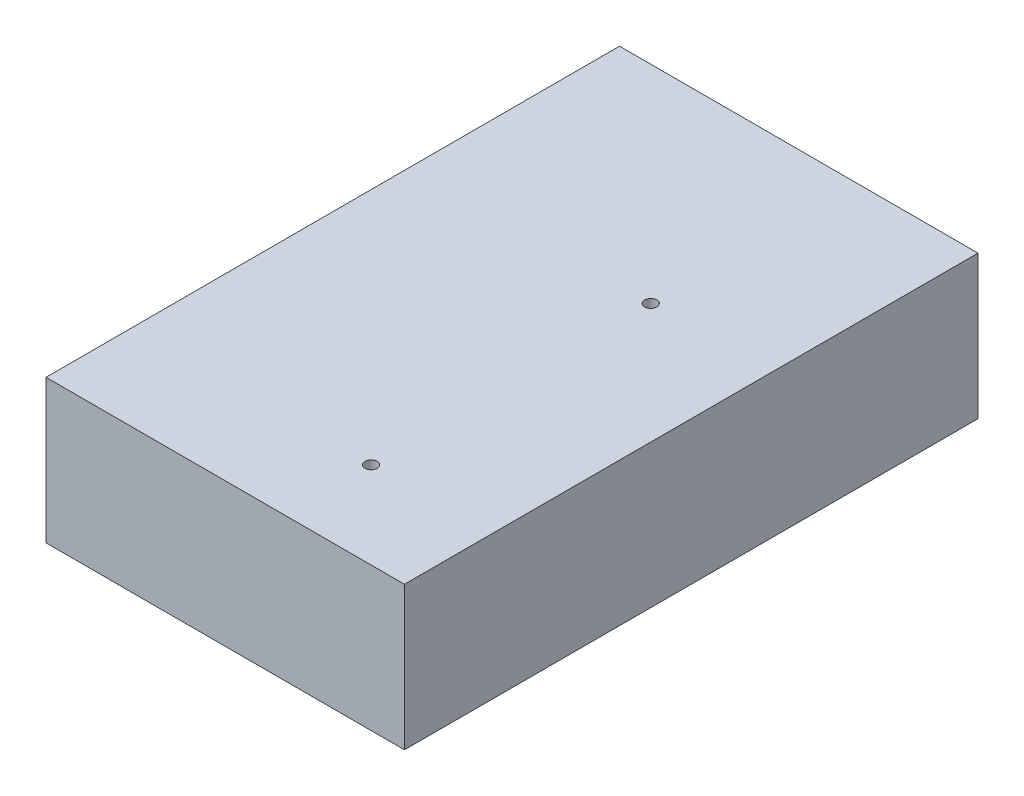
ISO-10303-21;
HEADER;
FILE_DESCRIPTION(('STEP AP214'),'2;1');
FILE_NAME('part.step','',(''),(''),'','','');
FILE_SCHEMA(('AUTOMOTIVE_DESIGN { 1 0 10303 214 1 1 1 1 }'));
ENDSEC;
DATA;
#1=APPLICATION_CONTEXT('core data for automotive mechanical design processes');
#2=APPLICATION_PROTOCOL_DEFINITION('international standard','automotive_design',2000,#1);
#3=PRODUCT_CONTEXT('',#1,'mechanical');
#4=PRODUCT('Part','Part','',(#3));
#5=PRODUCT_RELATED_PRODUCT_CATEGORY('part','',(#4));
#6=PRODUCT_DEFINITION_FORMATION('','',#4);
#7=PRODUCT_DEFINITION_CONTEXT('part definition',#1,'design');
#8=PRODUCT_DEFINITION('design','',#6,#7);
#9=PRODUCT_DEFINITION_SHAPE('','',#8);
#10=(LENGTH_UNIT() NAMED_UNIT(*) SI_UNIT(.MILLI.,.METRE.));
#11=(NAMED_UNIT(*) PLANE_ANGLE_UNIT() SI_UNIT($,.RADIAN.));
#12=(NAMED_UNIT(*) SI_UNIT($,.STERADIAN.) SOLID_ANGLE_UNIT());
#13=UNCERTAINTY_MEASURE_WITH_UNIT(LENGTH_MEASURE(1.E-05),#10,'distance_accuracy_value','');
#14=(GEOMETRIC_REPRESENTATION_CONTEXT(3) GLOBAL_UNCERTAINTY_ASSIGNED_CONTEXT((#13)) GLOBAL_UNIT_ASSIGNED_CONTEXT((#10,
#11,#12)) REPRESENTATION_CONTEXT('',''));
#15=CARTESIAN_POINT('',(0.,0.,0.));
#16=DIRECTION('',(0.,0.,1.));
#17=DIRECTION('',(1.,0.,0.));
#18=AXIS2_PLACEMENT_3D('',#15,#16,#17);
#19=CARTESIAN_POINT('',(50.,40.,80.));
#20=DIRECTION('',(-1.,0.,0.));
#21=DIRECTION('',(0.,0.,1.));
#22=AXIS2_PLACEMENT_3D('',#19,#20,#21);
#23=PLANE('',#22);
#24=DIRECTION('',(0.,0.,-1.));
#25=VECTOR('',#24,1.);
#26=CARTESIAN_POINT('',(50.,0.,80.));
#27=LINE('',#26,#25);
#28=CARTESIAN_POINT('',(50.,0.,80.));
#29=VERTEX_POINT('',#28);
#30=CARTESIAN_POINT('',(50.,0.,-80.));
#31=VERTEX_POINT('',#30);
#32=EDGE_CURVE('E98',#29,#31,#27,.T.);
#33=ORIENTED_EDGE('',*,*,#32,.T.);
#34=DIRECTION('',(0.,-1.,0.));
#35=VECTOR('',#34,1.);
#36=CARTESIAN_POINT('',(50.,40.,-80.));
#37=LINE('',#36,#35);
#38=CARTESIAN_POINT('',(50.,40.,-80.));
#39=VERTEX_POINT('',#38);
#40=EDGE_CURVE('E11',#39,#31,#37,.T.);
#41=ORIENTED_EDGE('',*,*,#40,.F.);
#42=DIRECTION('',(0.,0.,-1.));
#43=VECTOR('',#42,1.);
#44=CARTESIAN_POINT('',(50.,40.,80.));
#45=LINE('',#44,#43);
#46=CARTESIAN_POINT('',(50.,40.,80.));
#47=VERTEX_POINT('',#46);
#48=EDGE_CURVE('E86',#47,#39,#45,.T.);
#49=ORIENTED_EDGE('',*,*,#48,.F.);
#50=DIRECTION('',(0.,-1.,0.));
#51=VECTOR('',#50,1.);
#52=CARTESIAN_POINT('',(50.,40.,80.));
#53=LINE('',#52,#51);
#54=EDGE_CURVE('E94',#47,#29,#53,.T.);
#55=ORIENTED_EDGE('',*,*,#54,.T.);
#56=EDGE_LOOP('',(#33,#41,#49,#55));
#57=FACE_BOUND('',#56,.T.);
#58=ADVANCED_FACE('F35',(#57),#23,.F.);
#59=CARTESIAN_POINT('',(-50.,40.,-80.));
#60=DIRECTION('',(0.,0.,1.));
#61=DIRECTION('',(1.,0.,0.));
#62=AXIS2_PLACEMENT_3D('',#59,#60,#61);
#63=PLANE('',#62);
#64=DIRECTION('',(-1.,0.,0.));
#65=VECTOR('',#64,1.);
#66=CARTESIAN_POINT('',(-50.,0.,-80.));
#67=LINE('',#66,#65);
#68=CARTESIAN_POINT('',(-50.,0.,-80.));
#69=VERTEX_POINT('',#68);
#70=EDGE_CURVE('E90',#31,#69,#67,.T.);
#71=ORIENTED_EDGE('',*,*,#70,.T.);
#72=DIRECTION('',(0.,-1.,0.));
#73=VECTOR('',#72,1.);
#74=CARTESIAN_POINT('',(-50.,40.,-80.));
#75=LINE('',#74,#73);
#76=CARTESIAN_POINT('',(-50.,40.,-80.));
#77=VERTEX_POINT('',#76);
#78=EDGE_CURVE('E43',#77,#69,#75,.T.);
#79=ORIENTED_EDGE('',*,*,#78,.F.);
#80=DIRECTION('',(-1.,0.,0.));
#81=VECTOR('',#80,1.);
#82=CARTESIAN_POINT('',(-50.,40.,-80.));
#83=LINE('',#82,#81);
#84=EDGE_CURVE('E81',#39,#77,#83,.T.);
#85=ORIENTED_EDGE('',*,*,#84,.F.);
#86=ORIENTED_EDGE('',*,*,#40,.T.);
#87=EDGE_LOOP('',(#71,#79,#85,#86));
#88=FACE_BOUND('',#87,.T.);
#89=ADVANCED_FACE('F89',(#88),#63,.F.);
#90=CARTESIAN_POINT('',(-50.,40.,80.));
#91=DIRECTION('',(1.,0.,0.));
#92=DIRECTION('',(0.,0.,-1.));
#93=AXIS2_PLACEMENT_3D('',#90,#91,#92);
#94=PLANE('',#93);
#95=DIRECTION('',(0.,0.,1.));
#96=VECTOR('',#95,1.);
#97=CARTESIAN_POINT('',(-50.,0.,80.));
#98=LINE('',#97,#96);
#99=CARTESIAN_POINT('',(-50.,0.,80.));
#100=VERTEX_POINT('',#99);
#101=EDGE_CURVE('E68',#69,#100,#98,.T.);
#102=ORIENTED_EDGE('',*,*,#101,.T.);
#103=DIRECTION('',(0.,-1.,0.));
#104=VECTOR('',#103,1.);
#105=CARTESIAN_POINT('',(-50.,40.,80.));
#106=LINE('',#105,#104);
#107=CARTESIAN_POINT('',(-50.,40.,80.));
#108=VERTEX_POINT('',#107);
#109=EDGE_CURVE('E91',#108,#100,#106,.T.);
#110=ORIENTED_EDGE('',*,*,#109,.F.);
#111=DIRECTION('',(0.,0.,1.));
#112=VECTOR('',#111,1.);
#113=CARTESIAN_POINT('',(-50.,40.,80.));
#114=LINE('',#113,#112);
#115=EDGE_CURVE('E84',#77,#108,#114,.T.);
#116=ORIENTED_EDGE('',*,*,#115,.F.);
#117=ORIENTED_EDGE('',*,*,#78,.T.);
#118=EDGE_LOOP('',(#102,#110,#116,#117));
#119=FACE_BOUND('',#118,.T.);
#120=ADVANCED_FACE('F92',(#119),#94,.F.);
#121=CARTESIAN_POINT('',(-50.,40.,80.));
#122=DIRECTION('',(0.,0.,-1.));
#123=DIRECTION('',(-1.,0.,0.));
#124=AXIS2_PLACEMENT_3D('',#121,#122,#123);
#125=PLANE('',#124);
#126=DIRECTION('',(1.,0.,0.));
#127=VECTOR('',#126,1.);
#128=CARTESIAN_POINT('',(-50.,0.,80.));
#129=LINE('',#128,#127);
#130=EDGE_CURVE('E74',#100,#29,#129,.T.);
#131=ORIENTED_EDGE('',*,*,#130,.T.);
#132=ORIENTED_EDGE('',*,*,#54,.F.);
#133=DIRECTION('',(1.,0.,0.));
#134=VECTOR('',#133,1.);
#135=CARTESIAN_POINT('',(-50.,40.,80.));
#136=LINE('',#135,#134);
#137=EDGE_CURVE('E51',#108,#47,#136,.T.);
#138=ORIENTED_EDGE('',*,*,#137,.F.);
#139=ORIENTED_EDGE('',*,*,#109,.T.);
#140=EDGE_LOOP('',(#131,#132,#138,#139));
#141=FACE_BOUND('',#140,.T.);
#142=ADVANCED_FACE('F106',(#141),#125,.F.);
#143=CARTESIAN_POINT('',(0.,40.,0.));
#144=DIRECTION('',(0.,-1.,0.));
#145=DIRECTION('',(0.,0.,-1.));
#146=AXIS2_PLACEMENT_3D('',#143,#144,#145);
#147=PLANE('',#146);
#148=CARTESIAN_POINT('',(16.5,40.,55.8));
#149=DIRECTION('',(0.,-1.,0.));
#150=DIRECTION('',(0.,0.,-1.));
#151=AXIS2_PLACEMENT_3D('',#148,#149,#150);
#152=CIRCLE('',#151,1.7);
#153=CARTESIAN_POINT('',(16.5,40.,54.1));
#154=VERTEX_POINT('',#153);
#155=EDGE_CURVE('E101',#154,#154,#152,.T.);
#156=ORIENTED_EDGE('',*,*,#155,.T.);
#157=EDGE_LOOP('',(#156));
#158=FACE_BOUND('',#157,.T.);
#159=CARTESIAN_POINT('',(16.5,40.,-22.2));
#160=DIRECTION('',(0.,-1.,0.));
#161=DIRECTION('',(0.,0.,-1.));
#162=AXIS2_PLACEMENT_3D('',#159,#160,#161);
#163=CIRCLE('',#162,1.7);
#164=CARTESIAN_POINT('',(16.5,40.,-23.9));
#165=VERTEX_POINT('',#164);
#166=EDGE_CURVE('E115',#165,#165,#163,.T.);
#167=ORIENTED_EDGE('',*,*,#166,.T.);
#168=EDGE_LOOP('',(#167));
#169=FACE_BOUND('',#168,.T.);
#170=ORIENTED_EDGE('',*,*,#48,.T.);
#171=ORIENTED_EDGE('',*,*,#84,.T.);
#172=ORIENTED_EDGE('',*,*,#115,.T.);
#173=ORIENTED_EDGE('',*,*,#137,.T.);
#174=EDGE_LOOP('',(#170,#171,#172,#173));
#175=FACE_BOUND('',#174,.T.);
#176=ADVANCED_FACE('F82',(#158,#169,#175),#147,.F.);
#177=CARTESIAN_POINT('',(0.,0.,0.));
#178=DIRECTION('',(0.,-1.,0.));
#179=DIRECTION('',(0.,0.,-1.));
#180=AXIS2_PLACEMENT_3D('',#177,#178,#179);
#181=PLANE('',#180);
#182=CARTESIAN_POINT('',(16.5,0.,55.8));
#183=DIRECTION('',(0.,-1.,0.));
#184=DIRECTION('',(0.,0.,-1.));
#185=AXIS2_PLACEMENT_3D('',#182,#183,#184);
#186=CIRCLE('',#185,1.7);
#187=CARTESIAN_POINT('',(16.5,0.,54.1));
#188=VERTEX_POINT('',#187);
#189=EDGE_CURVE('E118',#188,#188,#186,.T.);
#190=ORIENTED_EDGE('',*,*,#189,.F.);
#191=EDGE_LOOP('',(#190));
#192=FACE_BOUND('',#191,.T.);
#193=CARTESIAN_POINT('',(16.5,0.,-22.2));
#194=DIRECTION('',(0.,-1.,0.));
#195=DIRECTION('',(0.,0.,-1.));
#196=AXIS2_PLACEMENT_3D('',#193,#194,#195);
#197=CIRCLE('',#196,1.7);
#198=CARTESIAN_POINT('',(16.5,0.,-23.9));
#199=VERTEX_POINT('',#198);
#200=EDGE_CURVE('E112',#199,#199,#197,.T.);
#201=ORIENTED_EDGE('',*,*,#200,.F.);
#202=EDGE_LOOP('',(#201));
#203=FACE_BOUND('',#202,.T.);
#204=ORIENTED_EDGE('',*,*,#32,.F.);
#205=ORIENTED_EDGE('',*,*,#130,.F.);
#206=ORIENTED_EDGE('',*,*,#101,.F.);
#207=ORIENTED_EDGE('',*,*,#70,.F.);
#208=EDGE_LOOP('',(#204,#205,#206,#207));
#209=FACE_BOUND('',#208,.T.);
#210=ADVANCED_FACE('F109',(#192,#203,#209),#181,.T.);
#211=CARTESIAN_POINT('',(16.5,40.,-22.2));
#212=DIRECTION('',(0.,-1.,0.));
#213=DIRECTION('',(0.,0.,-1.));
#214=AXIS2_PLACEMENT_3D('',#211,#212,#213);
#215=CYLINDRICAL_SURFACE('',#214,1.7);
#216=ORIENTED_EDGE('',*,*,#166,.F.);
#217=EDGE_LOOP('',(#216));
#218=FACE_BOUND('',#217,.T.);
#219=ORIENTED_EDGE('',*,*,#200,.T.);
#220=EDGE_LOOP('',(#219));
#221=FACE_BOUND('',#220,.T.);
#222=ADVANCED_FACE('F129',(#218,#221),#215,.F.);
#223=CARTESIAN_POINT('',(16.5,40.,55.8));
#224=DIRECTION('',(0.,-1.,0.));
#225=DIRECTION('',(0.,0.,-1.));
#226=AXIS2_PLACEMENT_3D('',#223,#224,#225);
#227=CYLINDRICAL_SURFACE('',#226,1.7);
#228=ORIENTED_EDGE('',*,*,#155,.F.);
#229=EDGE_LOOP('',(#228));
#230=FACE_BOUND('',#229,.T.);
#231=ORIENTED_EDGE('',*,*,#189,.T.);
#232=EDGE_LOOP('',(#231));
#233=FACE_BOUND('',#232,.T.);
#234=ADVANCED_FACE('F126',(#230,#233),#227,.F.);
#235=CLOSED_SHELL('',(#58,#89,#120,#142,#176,#210,#222,#234));
#236=MANIFOLD_SOLID_BREP('B2',#235);
#237=ADVANCED_BREP_SHAPE_REPRESENTATION('',(#18,#236),#14);
#238=SHAPE_DEFINITION_REPRESENTATION(#9,#237);
ENDSEC;
END-ISO-10303-21;
